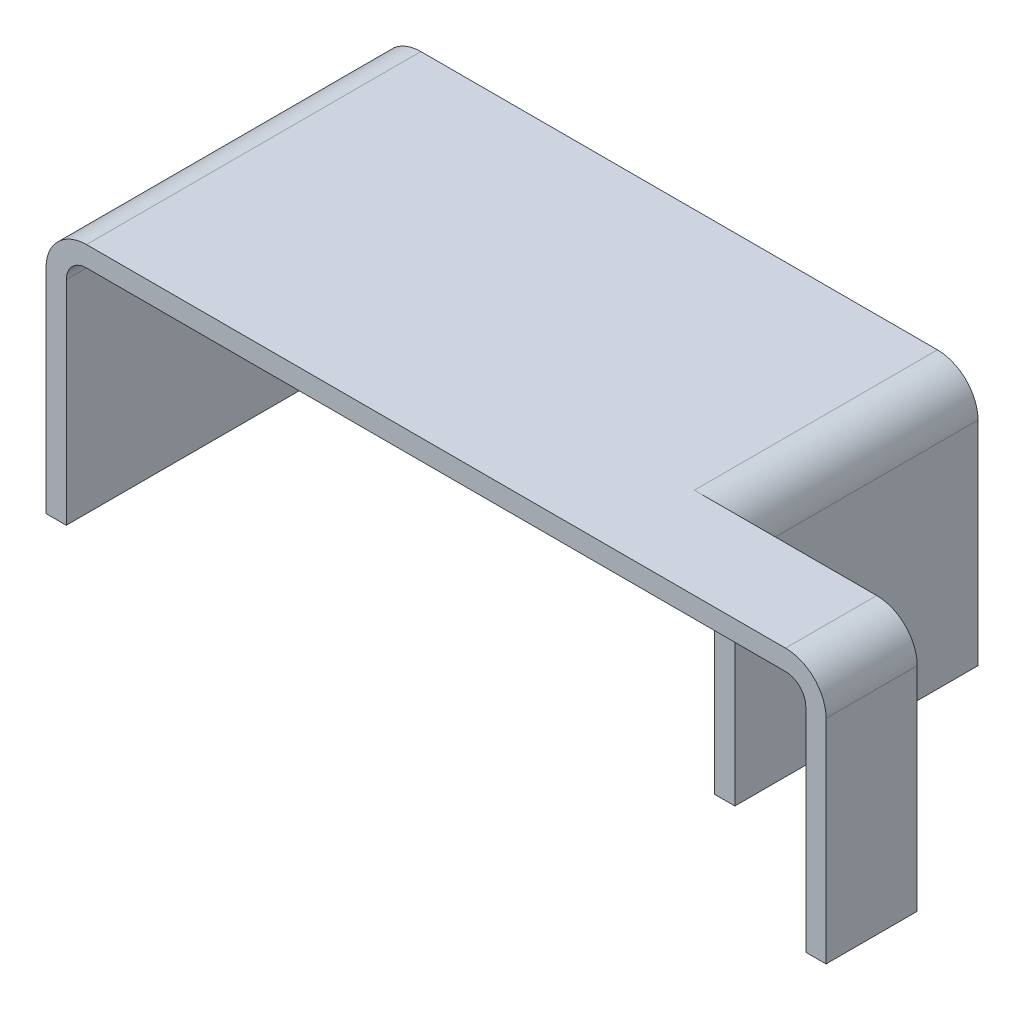
ISO-10303-21;
HEADER;
FILE_DESCRIPTION(('STEP AP214'),'2;1');
FILE_NAME('part.step','',(''),(''),'','','');
FILE_SCHEMA(('AUTOMOTIVE_DESIGN { 1 0 10303 214 1 1 1 1 }'));
ENDSEC;
DATA;
#1=APPLICATION_CONTEXT('core data for automotive mechanical design processes');
#2=APPLICATION_PROTOCOL_DEFINITION('international standard','automotive_design',2000,#1);
#3=PRODUCT_CONTEXT('',#1,'mechanical');
#4=PRODUCT('Part','Part','',(#3));
#5=PRODUCT_RELATED_PRODUCT_CATEGORY('part','',(#4));
#6=PRODUCT_DEFINITION_FORMATION('','',#4);
#7=PRODUCT_DEFINITION_CONTEXT('part definition',#1,'design');
#8=PRODUCT_DEFINITION('design','',#6,#7);
#9=PRODUCT_DEFINITION_SHAPE('','',#8);
#10=(LENGTH_UNIT() NAMED_UNIT(*) SI_UNIT(.MILLI.,.METRE.));
#11=(NAMED_UNIT(*) PLANE_ANGLE_UNIT() SI_UNIT($,.RADIAN.));
#12=(NAMED_UNIT(*) SI_UNIT($,.STERADIAN.) SOLID_ANGLE_UNIT());
#13=UNCERTAINTY_MEASURE_WITH_UNIT(LENGTH_MEASURE(1.E-05),#10,'distance_accuracy_value','');
#14=(GEOMETRIC_REPRESENTATION_CONTEXT(3) GLOBAL_UNCERTAINTY_ASSIGNED_CONTEXT((#13)) GLOBAL_UNIT_ASSIGNED_CONTEXT((#10,
#11,#12)) REPRESENTATION_CONTEXT('',''));
#15=CARTESIAN_POINT('',(0.,0.,0.));
#16=DIRECTION('',(0.,0.,1.));
#17=DIRECTION('',(1.,0.,0.));
#18=AXIS2_PLACEMENT_3D('',#15,#16,#17);
#19=CARTESIAN_POINT('',(0.,0.,0.));
#20=DIRECTION('',(0.,-1.,0.));
#21=DIRECTION('',(0.,0.,-1.));
#22=AXIS2_PLACEMENT_3D('',#19,#20,#21);
#23=PLANE('',#22);
#24=DIRECTION('',(0.,0.,-1.));
#25=VECTOR('',#24,1.);
#26=CARTESIAN_POINT('',(59.,0.,-33.));
#27=LINE('',#26,#25);
#28=CARTESIAN_POINT('',(59.,0.,-9.));
#29=VERTEX_POINT('',#28);
#30=CARTESIAN_POINT('',(59.,0.,-33.));
#31=VERTEX_POINT('',#30);
#32=EDGE_CURVE('E253',#29,#31,#27,.T.);
#33=ORIENTED_EDGE('',*,*,#32,.F.);
#34=DIRECTION('',(1.,0.,0.));
#35=VECTOR('',#34,1.);
#36=CARTESIAN_POINT('',(75.,0.,-9.));
#37=LINE('',#36,#35);
#38=CARTESIAN_POINT('',(57.,0.,-9.));
#39=VERTEX_POINT('',#38);
#40=EDGE_CURVE('E171',#39,#29,#37,.T.);
#41=ORIENTED_EDGE('',*,*,#40,.F.);
#42=DIRECTION('',(0.,0.,-1.));
#43=VECTOR('',#42,1.);
#44=CARTESIAN_POINT('',(57.,0.,0.));
#45=LINE('',#44,#43);
#46=CARTESIAN_POINT('',(57.,0.,-33.));
#47=VERTEX_POINT('',#46);
#48=EDGE_CURVE('E210',#39,#47,#45,.T.);
#49=ORIENTED_EDGE('',*,*,#48,.T.);
#50=DIRECTION('',(-1.,0.,0.));
#51=VECTOR('',#50,1.);
#52=CARTESIAN_POINT('',(0.,0.,-33.));
#53=LINE('',#52,#51);
#54=EDGE_CURVE('E257',#31,#47,#53,.T.);
#55=ORIENTED_EDGE('',*,*,#54,.F.);
#56=EDGE_LOOP('',(#33,#41,#49,#55));
#57=FACE_BOUND('',#56,.T.);
#58=ADVANCED_FACE('F33',(#57),#23,.T.);
#59=CARTESIAN_POINT('',(57.,0.,0.));
#60=DIRECTION('',(1.,0.,0.));
#61=DIRECTION('',(0.,0.,-1.));
#62=AXIS2_PLACEMENT_3D('',#59,#60,#61);
#63=PLANE('',#62);
#64=DIRECTION('',(0.,-1.,0.));
#65=VECTOR('',#64,1.);
#66=CARTESIAN_POINT('',(57.,0.,-9.));
#67=LINE('',#66,#65);
#68=CARTESIAN_POINT('',(57.,21.,-9.));
#69=VERTEX_POINT('',#68);
#70=EDGE_CURVE('E195',#69,#39,#67,.T.);
#71=ORIENTED_EDGE('',*,*,#70,.F.);
#72=DIRECTION('',(0.,0.,-1.));
#73=VECTOR('',#72,1.);
#74=CARTESIAN_POINT('',(57.,21.,0.));
#75=LINE('',#74,#73);
#76=CARTESIAN_POINT('',(57.,21.,-33.));
#77=VERTEX_POINT('',#76);
#78=EDGE_CURVE('E224',#69,#77,#75,.T.);
#79=ORIENTED_EDGE('',*,*,#78,.T.);
#80=DIRECTION('',(0.,-1.,0.));
#81=VECTOR('',#80,1.);
#82=CARTESIAN_POINT('',(57.,0.,-33.));
#83=LINE('',#82,#81);
#84=EDGE_CURVE('E200',#77,#47,#83,.T.);
#85=ORIENTED_EDGE('',*,*,#84,.T.);
#86=ORIENTED_EDGE('',*,*,#48,.F.);
#87=EDGE_LOOP('',(#71,#79,#85,#86));
#88=FACE_BOUND('',#87,.T.);
#89=ADVANCED_FACE('F356',(#88),#63,.F.);
#90=CARTESIAN_POINT('',(55.,21.,0.));
#91=DIRECTION('',(0.,0.,-1.));
#92=DIRECTION('',(-1.,0.,0.));
#93=AXIS2_PLACEMENT_3D('',#90,#91,#92);
#94=CYLINDRICAL_SURFACE('',#93,2.);
#95=CARTESIAN_POINT('',(55.,21.,-9.));
#96=DIRECTION('',(0.,0.,1.));
#97=DIRECTION('',(1.,0.,0.));
#98=AXIS2_PLACEMENT_3D('',#95,#96,#97);
#99=CIRCLE('',#98,2.);
#100=CARTESIAN_POINT('',(55.,23.,-9.));
#101=VERTEX_POINT('',#100);
#102=EDGE_CURVE('E192',#101,#69,#99,.F.);
#103=ORIENTED_EDGE('',*,*,#102,.F.);
#104=DIRECTION('',(0.,0.,-1.));
#105=VECTOR('',#104,1.);
#106=CARTESIAN_POINT('',(55.,23.,0.));
#107=LINE('',#106,#105);
#108=CARTESIAN_POINT('',(55.,23.,-33.));
#109=VERTEX_POINT('',#108);
#110=EDGE_CURVE('E227',#101,#109,#107,.T.);
#111=ORIENTED_EDGE('',*,*,#110,.T.);
#112=CARTESIAN_POINT('',(55.,21.,-33.));
#113=DIRECTION('',(0.,0.,-1.));
#114=DIRECTION('',(1.,0.,0.));
#115=AXIS2_PLACEMENT_3D('',#112,#113,#114);
#116=CIRCLE('',#115,2.);
#117=EDGE_CURVE('E205',#109,#77,#116,.T.);
#118=ORIENTED_EDGE('',*,*,#117,.T.);
#119=ORIENTED_EDGE('',*,*,#78,.F.);
#120=EDGE_LOOP('',(#103,#111,#118,#119));
#121=FACE_BOUND('',#120,.T.);
#122=ADVANCED_FACE('F349',(#121),#94,.F.);
#123=DIRECTION('',(0.,0.,1.));
#124=VECTOR('',#123,1.);
#125=CARTESIAN_POINT('',(75.,0.,-9.));
#126=LINE('',#125,#124);
#127=CARTESIAN_POINT('',(75.,0.,-9.));
#128=VERTEX_POINT('',#127);
#129=CARTESIAN_POINT('',(75.,0.,0.));
#130=VERTEX_POINT('',#129);
#131=EDGE_CURVE('E190',#128,#130,#126,.T.);
#132=ORIENTED_EDGE('',*,*,#131,.F.);
#133=DIRECTION('',(-1.,0.,0.));
#134=VECTOR('',#133,1.);
#135=CARTESIAN_POINT('',(59.,0.,-9.));
#136=LINE('',#135,#134);
#137=CARTESIAN_POINT('',(77.,0.,-9.));
#138=VERTEX_POINT('',#137);
#139=EDGE_CURVE('E182',#138,#128,#136,.T.);
#140=ORIENTED_EDGE('',*,*,#139,.F.);
#141=DIRECTION('',(0.,0.,-1.));
#142=VECTOR('',#141,1.);
#143=CARTESIAN_POINT('',(77.,0.,-9.));
#144=LINE('',#143,#142);
#145=CARTESIAN_POINT('',(77.,0.,0.));
#146=VERTEX_POINT('',#145);
#147=EDGE_CURVE('E249',#146,#138,#144,.T.);
#148=ORIENTED_EDGE('',*,*,#147,.F.);
#149=DIRECTION('',(1.,0.,0.));
#150=VECTOR('',#149,1.);
#151=CARTESIAN_POINT('',(77.,0.,0.));
#152=LINE('',#151,#150);
#153=EDGE_CURVE('E226',#130,#146,#152,.T.);
#154=ORIENTED_EDGE('',*,*,#153,.F.);
#155=EDGE_LOOP('',(#132,#140,#148,#154));
#156=FACE_BOUND('',#155,.T.);
#157=ADVANCED_FACE('F347',(#156),#23,.T.);
#158=CARTESIAN_POINT('',(77.,25.,0.));
#159=DIRECTION('',(0.,0.,-1.));
#160=DIRECTION('',(-1.,0.,0.));
#161=AXIS2_PLACEMENT_3D('',#158,#159,#160);
#162=PLANE('',#161);
#163=DIRECTION('',(1.,0.,0.));
#164=VECTOR('',#163,1.);
#165=CARTESIAN_POINT('',(77.,25.,0.));
#166=LINE('',#165,#164);
#167=CARTESIAN_POINT('',(4.,25.,0.));
#168=VERTEX_POINT('',#167);
#169=CARTESIAN_POINT('',(73.,25.,0.));
#170=VERTEX_POINT('',#169);
#171=EDGE_CURVE('E236',#168,#170,#166,.T.);
#172=ORIENTED_EDGE('',*,*,#171,.F.);
#173=CARTESIAN_POINT('',(4.,21.,0.));
#174=DIRECTION('',(0.,0.,-1.));
#175=DIRECTION('',(-1.,0.,0.));
#176=AXIS2_PLACEMENT_3D('',#173,#174,#175);
#177=CIRCLE('',#176,4.);
#178=CARTESIAN_POINT('',(0.,21.,0.));
#179=VERTEX_POINT('',#178);
#180=EDGE_CURVE('E282',#168,#179,#177,.F.);
#181=ORIENTED_EDGE('',*,*,#180,.T.);
#182=DIRECTION('',(0.,-1.,0.));
#183=VECTOR('',#182,1.);
#184=CARTESIAN_POINT('',(0.,25.,0.));
#185=LINE('',#184,#183);
#186=CARTESIAN_POINT('',(0.,0.,0.));
#187=VERTEX_POINT('',#186);
#188=EDGE_CURVE('E245',#179,#187,#185,.T.);
#189=ORIENTED_EDGE('',*,*,#188,.T.);
#190=CARTESIAN_POINT('',(2.,0.,0.));
#191=VERTEX_POINT('',#190);
#192=EDGE_CURVE('E246',#187,#191,#152,.T.);
#193=ORIENTED_EDGE('',*,*,#192,.T.);
#194=DIRECTION('',(0.,1.,0.));
#195=VECTOR('',#194,1.);
#196=CARTESIAN_POINT('',(2.,0.,0.));
#197=LINE('',#196,#195);
#198=CARTESIAN_POINT('',(2.,21.,0.));
#199=VERTEX_POINT('',#198);
#200=EDGE_CURVE('E201',#191,#199,#197,.T.);
#201=ORIENTED_EDGE('',*,*,#200,.T.);
#202=CARTESIAN_POINT('',(4.,21.,0.));
#203=DIRECTION('',(0.,0.,-1.));
#204=DIRECTION('',(1.,0.,0.));
#205=AXIS2_PLACEMENT_3D('',#202,#203,#204);
#206=CIRCLE('',#205,2.);
#207=CARTESIAN_POINT('',(4.,23.,0.));
#208=VERTEX_POINT('',#207);
#209=EDGE_CURVE('E204',#199,#208,#206,.T.);
#210=ORIENTED_EDGE('',*,*,#209,.T.);
#211=DIRECTION('',(1.,0.,0.));
#212=VECTOR('',#211,1.);
#213=CARTESIAN_POINT('',(55.,23.,0.));
#214=LINE('',#213,#212);
#215=CARTESIAN_POINT('',(73.,23.,0.));
#216=VERTEX_POINT('',#215);
#217=EDGE_CURVE('E208',#208,#216,#214,.T.);
#218=ORIENTED_EDGE('',*,*,#217,.T.);
#219=CARTESIAN_POINT('',(73.,21.,0.));
#220=DIRECTION('',(0.,0.,1.));
#221=DIRECTION('',(1.,0.,0.));
#222=AXIS2_PLACEMENT_3D('',#219,#220,#221);
#223=CIRCLE('',#222,2.);
#224=CARTESIAN_POINT('',(75.,21.,0.));
#225=VERTEX_POINT('',#224);
#226=EDGE_CURVE('E183',#225,#216,#223,.T.);
#227=ORIENTED_EDGE('',*,*,#226,.F.);
#228=DIRECTION('',(0.,1.,0.));
#229=VECTOR('',#228,1.);
#230=CARTESIAN_POINT('',(75.,0.,0.));
#231=LINE('',#230,#229);
#232=EDGE_CURVE('E166',#130,#225,#231,.T.);
#233=ORIENTED_EDGE('',*,*,#232,.F.);
#234=ORIENTED_EDGE('',*,*,#153,.T.);
#235=DIRECTION('',(0.,-1.,0.));
#236=VECTOR('',#235,1.);
#237=CARTESIAN_POINT('',(77.,25.,0.));
#238=LINE('',#237,#236);
#239=CARTESIAN_POINT('',(77.,21.,0.));
#240=VERTEX_POINT('',#239);
#241=EDGE_CURVE('E269',#240,#146,#238,.T.);
#242=ORIENTED_EDGE('',*,*,#241,.F.);
#243=CARTESIAN_POINT('',(73.,21.,0.));
#244=DIRECTION('',(0.,0.,-1.));
#245=DIRECTION('',(-1.,0.,0.));
#246=AXIS2_PLACEMENT_3D('',#243,#244,#245);
#247=CIRCLE('',#246,4.);
#248=EDGE_CURVE('E280',#240,#170,#247,.F.);
#249=ORIENTED_EDGE('',*,*,#248,.T.);
#250=EDGE_LOOP('',(#172,#181,#189,#193,#201,#210,#218,#227,#233,#234,#242,#249));
#251=FACE_BOUND('',#250,.T.);
#252=ADVANCED_FACE('F303',(#251),#162,.F.);
#253=CARTESIAN_POINT('',(77.,25.,-9.));
#254=DIRECTION('',(-1.,0.,0.));
#255=DIRECTION('',(0.,0.,1.));
#256=AXIS2_PLACEMENT_3D('',#253,#254,#255);
#257=PLANE('',#256);
#258=DIRECTION('',(0.,-1.,0.));
#259=VECTOR('',#258,1.);
#260=CARTESIAN_POINT('',(77.,25.,-9.));
#261=LINE('',#260,#259);
#262=CARTESIAN_POINT('',(77.,21.,-9.));
#263=VERTEX_POINT('',#262);
#264=EDGE_CURVE('E267',#263,#138,#261,.T.);
#265=ORIENTED_EDGE('',*,*,#264,.F.);
#266=DIRECTION('',(0.,0.,-1.));
#267=VECTOR('',#266,1.);
#268=CARTESIAN_POINT('',(77.,21.,-9.));
#269=LINE('',#268,#267);
#270=EDGE_CURVE('E41',#263,#240,#269,.F.);
#271=ORIENTED_EDGE('',*,*,#270,.T.);
#272=ORIENTED_EDGE('',*,*,#241,.T.);
#273=ORIENTED_EDGE('',*,*,#147,.T.);
#274=EDGE_LOOP('',(#265,#271,#272,#273));
#275=FACE_BOUND('',#274,.T.);
#276=ADVANCED_FACE('F297',(#275),#257,.F.);
#277=CARTESIAN_POINT('',(59.,25.,-9.));
#278=DIRECTION('',(0.,0.,1.));
#279=DIRECTION('',(1.,0.,0.));
#280=AXIS2_PLACEMENT_3D('',#277,#278,#279);
#281=PLANE('',#280);
#282=DIRECTION('',(-1.,0.,0.));
#283=VECTOR('',#282,1.);
#284=CARTESIAN_POINT('',(59.,25.,-9.));
#285=LINE('',#284,#283);
#286=CARTESIAN_POINT('',(73.,25.,-9.));
#287=VERTEX_POINT('',#286);
#288=CARTESIAN_POINT('',(55.,25.,-9.));
#289=VERTEX_POINT('',#288);
#290=EDGE_CURVE('E239',#287,#289,#285,.T.);
#291=ORIENTED_EDGE('',*,*,#290,.F.);
#292=CARTESIAN_POINT('',(73.,21.,-9.));
#293=DIRECTION('',(0.,0.,1.));
#294=DIRECTION('',(1.,0.,0.));
#295=AXIS2_PLACEMENT_3D('',#292,#293,#294);
#296=CIRCLE('',#295,4.);
#297=EDGE_CURVE('E48',#287,#263,#296,.F.);
#298=ORIENTED_EDGE('',*,*,#297,.T.);
#299=ORIENTED_EDGE('',*,*,#264,.T.);
#300=ORIENTED_EDGE('',*,*,#139,.T.);
#301=DIRECTION('',(0.,1.,0.));
#302=VECTOR('',#301,1.);
#303=CARTESIAN_POINT('',(75.,0.,-9.));
#304=LINE('',#303,#302);
#305=CARTESIAN_POINT('',(75.,21.,-9.));
#306=VERTEX_POINT('',#305);
#307=EDGE_CURVE('E163',#128,#306,#304,.T.);
#308=ORIENTED_EDGE('',*,*,#307,.T.);
#309=CARTESIAN_POINT('',(73.,21.,-9.));
#310=DIRECTION('',(0.,0.,1.));
#311=DIRECTION('',(1.,0.,0.));
#312=AXIS2_PLACEMENT_3D('',#309,#310,#311);
#313=CIRCLE('',#312,2.);
#314=CARTESIAN_POINT('',(73.,23.,-9.));
#315=VERTEX_POINT('',#314);
#316=EDGE_CURVE('E174',#306,#315,#313,.T.);
#317=ORIENTED_EDGE('',*,*,#316,.T.);
#318=DIRECTION('',(-1.,0.,0.));
#319=VECTOR('',#318,1.);
#320=CARTESIAN_POINT('',(73.,23.,-9.));
#321=LINE('',#320,#319);
#322=CARTESIAN_POINT('',(58.4641016151377,23.,-9.));
#323=VERTEX_POINT('',#322);
#324=EDGE_CURVE('E54',#315,#323,#321,.T.);
#325=ORIENTED_EDGE('',*,*,#324,.T.);
#326=CARTESIAN_POINT('',(55.,21.,-9.));
#327=DIRECTION('',(0.,0.,1.));
#328=DIRECTION('',(1.,0.,0.));
#329=AXIS2_PLACEMENT_3D('',#326,#327,#328);
#330=CIRCLE('',#329,4.);
#331=EDGE_CURVE('E11',#323,#289,#330,.T.);
#332=ORIENTED_EDGE('',*,*,#331,.T.);
#333=EDGE_LOOP('',(#291,#298,#299,#300,#308,#317,#325,#332));
#334=FACE_BOUND('',#333,.T.);
#335=ADVANCED_FACE('F180',(#334),#281,.F.);
#336=CARTESIAN_POINT('',(59.,25.,-33.));
#337=DIRECTION('',(-1.,0.,0.));
#338=DIRECTION('',(0.,0.,1.));
#339=AXIS2_PLACEMENT_3D('',#336,#337,#338);
#340=PLANE('',#339);
#341=DIRECTION('',(0.,-1.,0.));
#342=VECTOR('',#341,1.);
#343=CARTESIAN_POINT('',(59.,25.,-33.));
#344=LINE('',#343,#342);
#345=CARTESIAN_POINT('',(59.,21.,-33.));
#346=VERTEX_POINT('',#345);
#347=EDGE_CURVE('E265',#346,#31,#344,.T.);
#348=ORIENTED_EDGE('',*,*,#347,.F.);
#349=DIRECTION('',(0.,0.,-1.));
#350=VECTOR('',#349,1.);
#351=CARTESIAN_POINT('',(59.,21.,-33.));
#352=LINE('',#351,#350);
#353=CARTESIAN_POINT('',(59.,21.,-9.));
#354=VERTEX_POINT('',#353);
#355=EDGE_CURVE('E290',#346,#354,#352,.F.);
#356=ORIENTED_EDGE('',*,*,#355,.T.);
#357=DIRECTION('',(0.,1.,0.));
#358=VECTOR('',#357,1.);
#359=CARTESIAN_POINT('',(59.,25.,-9.));
#360=LINE('',#359,#358);
#361=EDGE_CURVE('E197',#29,#354,#360,.T.);
#362=ORIENTED_EDGE('',*,*,#361,.F.);
#363=ORIENTED_EDGE('',*,*,#32,.T.);
#364=EDGE_LOOP('',(#348,#356,#362,#363));
#365=FACE_BOUND('',#364,.T.);
#366=ADVANCED_FACE('F375',(#365),#340,.F.);
#367=CARTESIAN_POINT('',(0.,25.,-33.));
#368=DIRECTION('',(0.,0.,1.));
#369=DIRECTION('',(1.,0.,0.));
#370=AXIS2_PLACEMENT_3D('',#367,#368,#369);
#371=PLANE('',#370);
#372=DIRECTION('',(0.,-1.,0.));
#373=VECTOR('',#372,1.);
#374=CARTESIAN_POINT('',(0.,25.,-33.));
#375=LINE('',#374,#373);
#376=CARTESIAN_POINT('',(0.,21.,-33.));
#377=VERTEX_POINT('',#376);
#378=CARTESIAN_POINT('',(0.,0.,-33.));
#379=VERTEX_POINT('',#378);
#380=EDGE_CURVE('E263',#377,#379,#375,.T.);
#381=ORIENTED_EDGE('',*,*,#380,.F.);
#382=CARTESIAN_POINT('',(4.,21.,-33.));
#383=DIRECTION('',(0.,0.,1.));
#384=DIRECTION('',(1.,0.,0.));
#385=AXIS2_PLACEMENT_3D('',#382,#383,#384);
#386=CIRCLE('',#385,4.);
#387=CARTESIAN_POINT('',(4.,25.,-33.));
#388=VERTEX_POINT('',#387);
#389=EDGE_CURVE('E288',#377,#388,#386,.F.);
#390=ORIENTED_EDGE('',*,*,#389,.T.);
#391=DIRECTION('',(-1.,0.,0.));
#392=VECTOR('',#391,1.);
#393=CARTESIAN_POINT('',(0.,25.,-33.));
#394=LINE('',#393,#392);
#395=CARTESIAN_POINT('',(55.,25.,-33.));
#396=VERTEX_POINT('',#395);
#397=EDGE_CURVE('E242',#396,#388,#394,.T.);
#398=ORIENTED_EDGE('',*,*,#397,.F.);
#399=CARTESIAN_POINT('',(55.,21.,-33.));
#400=DIRECTION('',(0.,0.,1.));
#401=DIRECTION('',(1.,0.,0.));
#402=AXIS2_PLACEMENT_3D('',#399,#400,#401);
#403=CIRCLE('',#402,4.);
#404=EDGE_CURVE('E286',#396,#346,#403,.F.);
#405=ORIENTED_EDGE('',*,*,#404,.T.);
#406=ORIENTED_EDGE('',*,*,#347,.T.);
#407=ORIENTED_EDGE('',*,*,#54,.T.);
#408=ORIENTED_EDGE('',*,*,#84,.F.);
#409=ORIENTED_EDGE('',*,*,#117,.F.);
#410=DIRECTION('',(1.,0.,0.));
#411=VECTOR('',#410,1.);
#412=CARTESIAN_POINT('',(55.,23.,-33.));
#413=LINE('',#412,#411);
#414=CARTESIAN_POINT('',(4.,23.,-33.));
#415=VERTEX_POINT('',#414);
#416=EDGE_CURVE('E219',#415,#109,#413,.T.);
#417=ORIENTED_EDGE('',*,*,#416,.F.);
#418=CARTESIAN_POINT('',(4.,21.,-33.));
#419=DIRECTION('',(0.,0.,-1.));
#420=DIRECTION('',(1.,0.,0.));
#421=AXIS2_PLACEMENT_3D('',#418,#419,#420);
#422=CIRCLE('',#421,2.);
#423=CARTESIAN_POINT('',(2.,21.,-33.));
#424=VERTEX_POINT('',#423);
#425=EDGE_CURVE('E216',#424,#415,#422,.T.);
#426=ORIENTED_EDGE('',*,*,#425,.F.);
#427=DIRECTION('',(0.,1.,0.));
#428=VECTOR('',#427,1.);
#429=CARTESIAN_POINT('',(2.,0.,-33.));
#430=LINE('',#429,#428);
#431=CARTESIAN_POINT('',(2.,0.,-33.));
#432=VERTEX_POINT('',#431);
#433=EDGE_CURVE('E213',#432,#424,#430,.T.);
#434=ORIENTED_EDGE('',*,*,#433,.F.);
#435=EDGE_CURVE('E256',#432,#379,#53,.T.);
#436=ORIENTED_EDGE('',*,*,#435,.T.);
#437=EDGE_LOOP('',(#381,#390,#398,#405,#406,#407,#408,#409,#417,#426,#434,#436));
#438=FACE_BOUND('',#437,.T.);
#439=ADVANCED_FACE('F319',(#438),#371,.F.);
#440=CARTESIAN_POINT('',(0.,25.,0.));
#441=DIRECTION('',(1.,0.,0.));
#442=DIRECTION('',(0.,0.,-1.));
#443=AXIS2_PLACEMENT_3D('',#440,#441,#442);
#444=PLANE('',#443);
#445=ORIENTED_EDGE('',*,*,#188,.F.);
#446=DIRECTION('',(0.,0.,1.));
#447=VECTOR('',#446,1.);
#448=CARTESIAN_POINT('',(0.,21.,0.));
#449=LINE('',#448,#447);
#450=EDGE_CURVE('E284',#179,#377,#449,.F.);
#451=ORIENTED_EDGE('',*,*,#450,.T.);
#452=ORIENTED_EDGE('',*,*,#380,.T.);
#453=DIRECTION('',(0.,0.,1.));
#454=VECTOR('',#453,1.);
#455=CARTESIAN_POINT('',(0.,0.,0.));
#456=LINE('',#455,#454);
#457=EDGE_CURVE('E240',#379,#187,#456,.T.);
#458=ORIENTED_EDGE('',*,*,#457,.T.);
#459=EDGE_LOOP('',(#445,#451,#452,#458));
#460=FACE_BOUND('',#459,.T.);
#461=ADVANCED_FACE('F328',(#460),#444,.F.);
#462=CARTESIAN_POINT('',(0.,25.,0.));
#463=DIRECTION('',(0.,-1.,0.));
#464=DIRECTION('',(0.,0.,-1.));
#465=AXIS2_PLACEMENT_3D('',#462,#463,#464);
#466=PLANE('',#465);
#467=ORIENTED_EDGE('',*,*,#397,.T.);
#468=DIRECTION('',(0.,0.,1.));
#469=VECTOR('',#468,1.);
#470=CARTESIAN_POINT('',(4.,25.,0.));
#471=LINE('',#470,#469);
#472=EDGE_CURVE('E277',#388,#168,#471,.T.);
#473=ORIENTED_EDGE('',*,*,#472,.T.);
#474=ORIENTED_EDGE('',*,*,#171,.T.);
#475=DIRECTION('',(0.,0.,-1.));
#476=VECTOR('',#475,1.);
#477=CARTESIAN_POINT('',(73.,25.,0.));
#478=LINE('',#477,#476);
#479=EDGE_CURVE('E271',#170,#287,#478,.T.);
#480=ORIENTED_EDGE('',*,*,#479,.T.);
#481=ORIENTED_EDGE('',*,*,#290,.T.);
#482=DIRECTION('',(0.,0.,-1.));
#483=VECTOR('',#482,1.);
#484=CARTESIAN_POINT('',(55.,25.,0.));
#485=LINE('',#484,#483);
#486=EDGE_CURVE('E274',#289,#396,#485,.T.);
#487=ORIENTED_EDGE('',*,*,#486,.T.);
#488=EDGE_LOOP('',(#467,#473,#474,#480,#481,#487));
#489=FACE_BOUND('',#488,.T.);
#490=ADVANCED_FACE('F308',(#489),#466,.F.);
#491=DIRECTION('',(0.,0.,-1.));
#492=VECTOR('',#491,1.);
#493=CARTESIAN_POINT('',(2.,0.,0.));
#494=LINE('',#493,#492);
#495=EDGE_CURVE('E233',#191,#432,#494,.T.);
#496=ORIENTED_EDGE('',*,*,#495,.F.);
#497=ORIENTED_EDGE('',*,*,#192,.F.);
#498=ORIENTED_EDGE('',*,*,#457,.F.);
#499=ORIENTED_EDGE('',*,*,#435,.F.);
#500=EDGE_LOOP('',(#496,#497,#498,#499));
#501=FACE_BOUND('',#500,.T.);
#502=ADVANCED_FACE('F334',(#501),#23,.T.);
#503=CARTESIAN_POINT('',(55.,23.,0.));
#504=DIRECTION('',(0.,1.,0.));
#505=DIRECTION('',(0.,0.,1.));
#506=AXIS2_PLACEMENT_3D('',#503,#504,#505);
#507=PLANE('',#506);
#508=DIRECTION('',(0.,0.,1.));
#509=VECTOR('',#508,1.);
#510=CARTESIAN_POINT('',(73.,23.,-9.));
#511=LINE('',#510,#509);
#512=EDGE_CURVE('E170',#315,#216,#511,.T.);
#513=ORIENTED_EDGE('',*,*,#512,.T.);
#514=ORIENTED_EDGE('',*,*,#217,.F.);
#515=DIRECTION('',(0.,0.,-1.));
#516=VECTOR('',#515,1.);
#517=CARTESIAN_POINT('',(4.,23.,0.));
#518=LINE('',#517,#516);
#519=EDGE_CURVE('E229',#208,#415,#518,.T.);
#520=ORIENTED_EDGE('',*,*,#519,.T.);
#521=ORIENTED_EDGE('',*,*,#416,.T.);
#522=ORIENTED_EDGE('',*,*,#110,.F.);
#523=EDGE_CURVE('E177',#323,#101,#321,.T.);
#524=ORIENTED_EDGE('',*,*,#523,.F.);
#525=ORIENTED_EDGE('',*,*,#324,.F.);
#526=EDGE_LOOP('',(#513,#514,#520,#521,#522,#524,#525));
#527=FACE_BOUND('',#526,.T.);
#528=ADVANCED_FACE('F345',(#527),#507,.F.);
#529=CARTESIAN_POINT('',(4.,21.,0.));
#530=DIRECTION('',(0.,0.,-1.));
#531=DIRECTION('',(-1.,0.,0.));
#532=AXIS2_PLACEMENT_3D('',#529,#530,#531);
#533=CYLINDRICAL_SURFACE('',#532,2.);
#534=ORIENTED_EDGE('',*,*,#425,.T.);
#535=ORIENTED_EDGE('',*,*,#519,.F.);
#536=ORIENTED_EDGE('',*,*,#209,.F.);
#537=DIRECTION('',(0.,0.,-1.));
#538=VECTOR('',#537,1.);
#539=CARTESIAN_POINT('',(2.,21.,0.));
#540=LINE('',#539,#538);
#541=EDGE_CURVE('E231',#199,#424,#540,.T.);
#542=ORIENTED_EDGE('',*,*,#541,.T.);
#543=EDGE_LOOP('',(#534,#535,#536,#542));
#544=FACE_BOUND('',#543,.T.);
#545=ADVANCED_FACE('F341',(#544),#533,.F.);
#546=CARTESIAN_POINT('',(2.,0.,0.));
#547=DIRECTION('',(-1.,0.,0.));
#548=DIRECTION('',(0.,0.,1.));
#549=AXIS2_PLACEMENT_3D('',#546,#547,#548);
#550=PLANE('',#549);
#551=ORIENTED_EDGE('',*,*,#433,.T.);
#552=ORIENTED_EDGE('',*,*,#541,.F.);
#553=ORIENTED_EDGE('',*,*,#200,.F.);
#554=ORIENTED_EDGE('',*,*,#495,.T.);
#555=EDGE_LOOP('',(#551,#552,#553,#554));
#556=FACE_BOUND('',#555,.T.);
#557=ADVANCED_FACE('F337',(#556),#550,.F.);
#558=CARTESIAN_POINT('',(73.,21.,-9.));
#559=DIRECTION('',(0.,0.,1.));
#560=DIRECTION('',(1.,0.,0.));
#561=AXIS2_PLACEMENT_3D('',#558,#559,#560);
#562=PLANE('',#561);
#563=ORIENTED_EDGE('',*,*,#361,.T.);
#564=CARTESIAN_POINT('',(55.,21.,-9.));
#565=DIRECTION('',(0.,0.,1.));
#566=DIRECTION('',(1.,0.,0.));
#567=AXIS2_PLACEMENT_3D('',#564,#565,#566);
#568=CIRCLE('',#567,4.);
#569=EDGE_CURVE('E292',#354,#323,#568,.T.);
#570=ORIENTED_EDGE('',*,*,#569,.T.);
#571=ORIENTED_EDGE('',*,*,#523,.T.);
#572=ORIENTED_EDGE('',*,*,#102,.T.);
#573=ORIENTED_EDGE('',*,*,#70,.T.);
#574=ORIENTED_EDGE('',*,*,#40,.T.);
#575=EDGE_LOOP('',(#563,#570,#571,#572,#573,#574));
#576=FACE_BOUND('',#575,.T.);
#577=ADVANCED_FACE('F377',(#576),#562,.T.);
#578=CARTESIAN_POINT('',(75.,0.,-9.));
#579=DIRECTION('',(1.,0.,0.));
#580=DIRECTION('',(0.,0.,-1.));
#581=AXIS2_PLACEMENT_3D('',#578,#579,#580);
#582=PLANE('',#581);
#583=ORIENTED_EDGE('',*,*,#232,.T.);
#584=DIRECTION('',(0.,0.,1.));
#585=VECTOR('',#584,1.);
#586=CARTESIAN_POINT('',(75.,21.,-9.));
#587=LINE('',#586,#585);
#588=EDGE_CURVE('E159',#306,#225,#587,.T.);
#589=ORIENTED_EDGE('',*,*,#588,.F.);
#590=ORIENTED_EDGE('',*,*,#307,.F.);
#591=ORIENTED_EDGE('',*,*,#131,.T.);
#592=EDGE_LOOP('',(#583,#589,#590,#591));
#593=FACE_BOUND('',#592,.T.);
#594=ADVANCED_FACE('F161',(#593),#582,.F.);
#595=CARTESIAN_POINT('',(73.,21.,-9.));
#596=DIRECTION('',(0.,0.,1.));
#597=DIRECTION('',(1.,0.,0.));
#598=AXIS2_PLACEMENT_3D('',#595,#596,#597);
#599=CYLINDRICAL_SURFACE('',#598,2.);
#600=ORIENTED_EDGE('',*,*,#226,.T.);
#601=ORIENTED_EDGE('',*,*,#512,.F.);
#602=ORIENTED_EDGE('',*,*,#316,.F.);
#603=ORIENTED_EDGE('',*,*,#588,.T.);
#604=EDGE_LOOP('',(#600,#601,#602,#603));
#605=FACE_BOUND('',#604,.T.);
#606=ADVANCED_FACE('F175',(#605),#599,.F.);
#607=CARTESIAN_POINT('',(4.,21.,0.));
#608=DIRECTION('',(0.,0.,1.));
#609=DIRECTION('',(1.,0.,0.));
#610=AXIS2_PLACEMENT_3D('',#607,#608,#609);
#611=CYLINDRICAL_SURFACE('',#610,4.);
#612=ORIENTED_EDGE('',*,*,#389,.F.);
#613=ORIENTED_EDGE('',*,*,#450,.F.);
#614=ORIENTED_EDGE('',*,*,#180,.F.);
#615=ORIENTED_EDGE('',*,*,#472,.F.);
#616=EDGE_LOOP('',(#612,#613,#614,#615));
#617=FACE_BOUND('',#616,.T.);
#618=ADVANCED_FACE('F325',(#617),#611,.T.);
#619=CARTESIAN_POINT('',(55.,21.,0.));
#620=DIRECTION('',(0.,0.,-1.));
#621=DIRECTION('',(-1.,0.,0.));
#622=AXIS2_PLACEMENT_3D('',#619,#620,#621);
#623=CYLINDRICAL_SURFACE('',#622,4.);
#624=ORIENTED_EDGE('',*,*,#569,.F.);
#625=ORIENTED_EDGE('',*,*,#355,.F.);
#626=ORIENTED_EDGE('',*,*,#404,.F.);
#627=ORIENTED_EDGE('',*,*,#486,.F.);
#628=ORIENTED_EDGE('',*,*,#331,.F.);
#629=EDGE_LOOP('',(#624,#625,#626,#627,#628));
#630=FACE_BOUND('',#629,.T.);
#631=ADVANCED_FACE('F313',(#630),#623,.T.);
#632=CARTESIAN_POINT('',(73.,21.,0.));
#633=DIRECTION('',(0.,0.,-1.));
#634=DIRECTION('',(-1.,0.,0.));
#635=AXIS2_PLACEMENT_3D('',#632,#633,#634);
#636=CYLINDRICAL_SURFACE('',#635,4.);
#637=ORIENTED_EDGE('',*,*,#248,.F.);
#638=ORIENTED_EDGE('',*,*,#270,.F.);
#639=ORIENTED_EDGE('',*,*,#297,.F.);
#640=ORIENTED_EDGE('',*,*,#479,.F.);
#641=EDGE_LOOP('',(#637,#638,#639,#640));
#642=FACE_BOUND('',#641,.T.);
#643=ADVANCED_FACE('F35',(#642),#636,.T.);
#644=CLOSED_SHELL('',(#58,#89,#122,#157,#252,#276,#335,#366,#439,#461,#490,#502,#528,#545,#557,
#577,#594,#606,#618,#631,#643));
#645=MANIFOLD_SOLID_BREP('B2',#644);
#646=ADVANCED_BREP_SHAPE_REPRESENTATION('',(#18,#645),#14);
#647=SHAPE_DEFINITION_REPRESENTATION(#9,#646);
ENDSEC;
END-ISO-10303-21;
